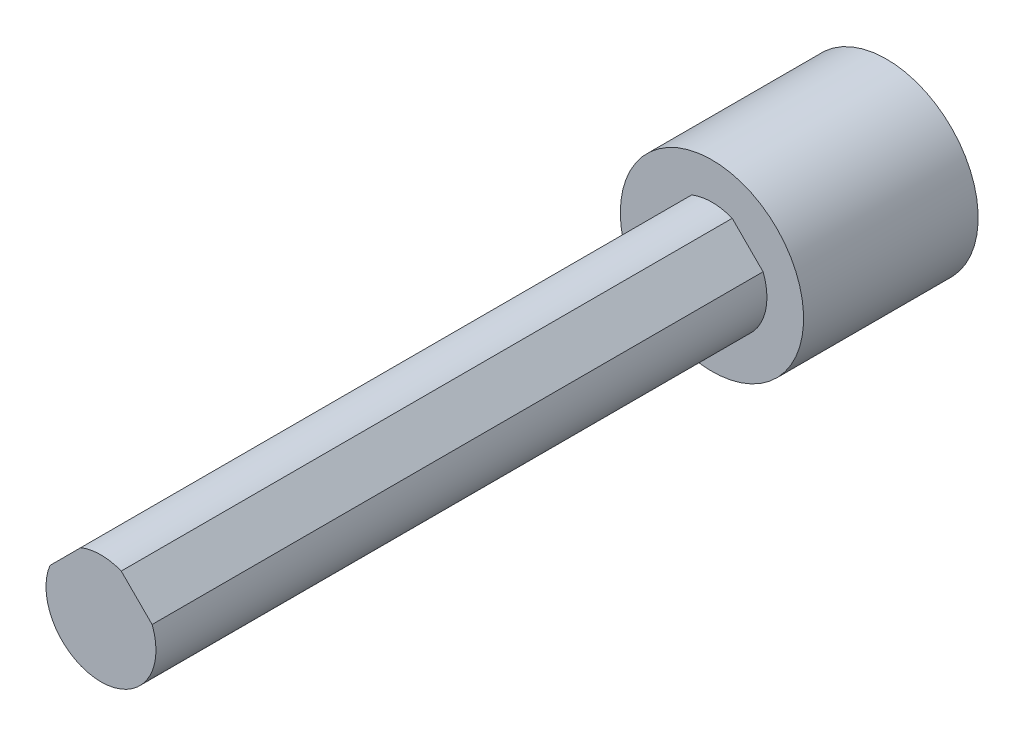
ISO-10303-21;
HEADER;
FILE_DESCRIPTION(('STEP AP214'),'2;1');
FILE_NAME('part.step','',(''),(''),'','','');
FILE_SCHEMA(('AUTOMOTIVE_DESIGN { 1 0 10303 214 1 1 1 1 }'));
ENDSEC;
DATA;
#1=APPLICATION_CONTEXT('core data for automotive mechanical design processes');
#2=APPLICATION_PROTOCOL_DEFINITION('international standard','automotive_design',2000,#1);
#3=PRODUCT_CONTEXT('',#1,'mechanical');
#4=PRODUCT('Part','Part','',(#3));
#5=PRODUCT_RELATED_PRODUCT_CATEGORY('part','',(#4));
#6=PRODUCT_DEFINITION_FORMATION('','',#4);
#7=PRODUCT_DEFINITION_CONTEXT('part definition',#1,'design');
#8=PRODUCT_DEFINITION('design','',#6,#7);
#9=PRODUCT_DEFINITION_SHAPE('','',#8);
#10=(LENGTH_UNIT() NAMED_UNIT(*) SI_UNIT(.MILLI.,.METRE.));
#11=(NAMED_UNIT(*) PLANE_ANGLE_UNIT() SI_UNIT($,.RADIAN.));
#12=(NAMED_UNIT(*) SI_UNIT($,.STERADIAN.) SOLID_ANGLE_UNIT());
#13=UNCERTAINTY_MEASURE_WITH_UNIT(LENGTH_MEASURE(1.E-05),#10,'distance_accuracy_value','');
#14=(GEOMETRIC_REPRESENTATION_CONTEXT(3) GLOBAL_UNCERTAINTY_ASSIGNED_CONTEXT((#13)) GLOBAL_UNIT_ASSIGNED_CONTEXT((#10,
#11,#12)) REPRESENTATION_CONTEXT('',''));
#15=CARTESIAN_POINT('',(0.,0.,0.));
#16=DIRECTION('',(0.,0.,1.));
#17=DIRECTION('',(1.,0.,0.));
#18=AXIS2_PLACEMENT_3D('',#15,#16,#17);
#19=CARTESIAN_POINT('',(0.,0.,44.45));
#20=DIRECTION('',(0.,0.,-1.));
#21=DIRECTION('',(-1.,0.,0.));
#22=AXIS2_PLACEMENT_3D('',#19,#20,#21);
#23=CYLINDRICAL_SURFACE('',#22,4.0005);
#24=CARTESIAN_POINT('',(0.,0.,0.));
#25=DIRECTION('',(0.,0.,1.));
#26=DIRECTION('',(1.,0.,0.));
#27=AXIS2_PLACEMENT_3D('',#24,#25,#26);
#28=CIRCLE('',#27,4.0005);
#29=CARTESIAN_POINT('',(1.47398911899948,3.71905314926678,0.));
#30=VERTEX_POINT('',#29);
#31=CARTESIAN_POINT('',(-1.47398911899948,3.71905314926678,0.));
#32=VERTEX_POINT('',#31);
#33=EDGE_CURVE('E75',#30,#32,#28,.T.);
#34=ORIENTED_EDGE('',*,*,#33,.T.);
#35=DIRECTION('',(0.,0.,-1.));
#36=VECTOR('',#35,1.);
#37=CARTESIAN_POINT('',(-1.47398911899948,3.71905314926678,44.45));
#38=LINE('',#37,#36);
#39=CARTESIAN_POINT('',(-1.47398911899948,3.71905314926678,44.45));
#40=VERTEX_POINT('',#39);
#41=EDGE_CURVE('E11',#40,#32,#38,.T.);
#42=ORIENTED_EDGE('',*,*,#41,.F.);
#43=CARTESIAN_POINT('',(0.,0.,44.45));
#44=DIRECTION('',(0.,0.,1.));
#45=DIRECTION('',(1.,0.,0.));
#46=AXIS2_PLACEMENT_3D('',#43,#44,#45);
#47=CIRCLE('',#46,4.0005);
#48=CARTESIAN_POINT('',(1.47398911899948,3.71905314926678,44.45));
#49=VERTEX_POINT('',#48);
#50=EDGE_CURVE('E79',#49,#40,#47,.T.);
#51=ORIENTED_EDGE('',*,*,#50,.F.);
#52=DIRECTION('',(0.,0.,-1.));
#53=VECTOR('',#52,1.);
#54=CARTESIAN_POINT('',(1.47398911899948,3.71905314926678,44.45));
#55=LINE('',#54,#53);
#56=EDGE_CURVE('E91',#49,#30,#55,.T.);
#57=ORIENTED_EDGE('',*,*,#56,.T.);
#58=EDGE_LOOP('',(#34,#42,#51,#57));
#59=FACE_BOUND('',#58,.T.);
#60=ADVANCED_FACE('F33',(#59),#23,.T.);
#61=CARTESIAN_POINT('',(-1.47398911899948,3.71905314926678,44.45));
#62=DIRECTION('',(0.707106781186546,-0.707106781186549,0.));
#63=DIRECTION('',(0.707106781186549,0.707106781186546,0.));
#64=AXIS2_PLACEMENT_3D('',#61,#62,#63);
#65=PLANE('',#64);
#66=DIRECTION('',(-0.707106781186549,-0.707106781186546,0.));
#67=VECTOR('',#66,1.);
#68=CARTESIAN_POINT('',(-1.47398911899948,3.71905314926678,0.));
#69=LINE('',#68,#67);
#70=CARTESIAN_POINT('',(-3.71905314926677,1.47398911899949,0.));
#71=VERTEX_POINT('',#70);
#72=EDGE_CURVE('E88',#32,#71,#69,.T.);
#73=ORIENTED_EDGE('',*,*,#72,.T.);
#74=DIRECTION('',(0.,0.,-1.));
#75=VECTOR('',#74,1.);
#76=CARTESIAN_POINT('',(-3.71905314926677,1.47398911899949,44.45));
#77=LINE('',#76,#75);
#78=CARTESIAN_POINT('',(-3.71905314926677,1.47398911899949,44.45));
#79=VERTEX_POINT('',#78);
#80=EDGE_CURVE('E41',#79,#71,#77,.T.);
#81=ORIENTED_EDGE('',*,*,#80,.F.);
#82=DIRECTION('',(-0.707106781186549,-0.707106781186546,0.));
#83=VECTOR('',#82,1.);
#84=CARTESIAN_POINT('',(-1.47398911899948,3.71905314926678,44.45));
#85=LINE('',#84,#83);
#86=EDGE_CURVE('E101',#40,#79,#85,.T.);
#87=ORIENTED_EDGE('',*,*,#86,.F.);
#88=ORIENTED_EDGE('',*,*,#41,.T.);
#89=EDGE_LOOP('',(#73,#81,#87,#88));
#90=FACE_BOUND('',#89,.T.);
#91=ADVANCED_FACE('F127',(#90),#65,.F.);
#92=CARTESIAN_POINT('',(0.,0.,44.45));
#93=DIRECTION('',(0.,0.,-1.));
#94=DIRECTION('',(-1.,0.,0.));
#95=AXIS2_PLACEMENT_3D('',#92,#93,#94);
#96=CYLINDRICAL_SURFACE('',#95,4.0005);
#97=CARTESIAN_POINT('',(0.,0.,0.));
#98=DIRECTION('',(0.,0.,1.));
#99=DIRECTION('',(1.,0.,0.));
#100=AXIS2_PLACEMENT_3D('',#97,#98,#99);
#101=CIRCLE('',#100,4.0005);
#102=CARTESIAN_POINT('',(3.71905314926677,1.47398911899949,0.));
#103=VERTEX_POINT('',#102);
#104=EDGE_CURVE('E72',#71,#103,#101,.T.);
#105=ORIENTED_EDGE('',*,*,#104,.T.);
#106=DIRECTION('',(0.,0.,-1.));
#107=VECTOR('',#106,1.);
#108=CARTESIAN_POINT('',(3.71905314926677,1.47398911899949,44.45));
#109=LINE('',#108,#107);
#110=CARTESIAN_POINT('',(3.71905314926677,1.47398911899949,44.45));
#111=VERTEX_POINT('',#110);
#112=EDGE_CURVE('E86',#111,#103,#109,.T.);
#113=ORIENTED_EDGE('',*,*,#112,.F.);
#114=CARTESIAN_POINT('',(0.,0.,44.45));
#115=DIRECTION('',(0.,0.,1.));
#116=DIRECTION('',(1.,0.,0.));
#117=AXIS2_PLACEMENT_3D('',#114,#115,#116);
#118=CIRCLE('',#117,4.0005);
#119=EDGE_CURVE('E99',#79,#111,#118,.T.);
#120=ORIENTED_EDGE('',*,*,#119,.F.);
#121=ORIENTED_EDGE('',*,*,#80,.T.);
#122=EDGE_LOOP('',(#105,#113,#120,#121));
#123=FACE_BOUND('',#122,.T.);
#124=ADVANCED_FACE('F84',(#123),#96,.T.);
#125=CARTESIAN_POINT('',(1.47398911899948,3.71905314926678,44.45));
#126=DIRECTION('',(-0.707106781186546,-0.707106781186549,0.));
#127=DIRECTION('',(0.707106781186549,-0.707106781186546,0.));
#128=AXIS2_PLACEMENT_3D('',#125,#126,#127);
#129=PLANE('',#128);
#130=DIRECTION('',(-0.707106781186549,0.707106781186546,0.));
#131=VECTOR('',#130,1.);
#132=CARTESIAN_POINT('',(1.47398911899948,3.71905314926678,0.));
#133=LINE('',#132,#131);
#134=EDGE_CURVE('E69',#103,#30,#133,.T.);
#135=ORIENTED_EDGE('',*,*,#134,.T.);
#136=ORIENTED_EDGE('',*,*,#56,.F.);
#137=DIRECTION('',(-0.707106781186549,0.707106781186546,0.));
#138=VECTOR('',#137,1.);
#139=CARTESIAN_POINT('',(1.47398911899948,3.71905314926678,44.45));
#140=LINE('',#139,#138);
#141=EDGE_CURVE('E48',#111,#49,#140,.T.);
#142=ORIENTED_EDGE('',*,*,#141,.F.);
#143=ORIENTED_EDGE('',*,*,#112,.T.);
#144=EDGE_LOOP('',(#135,#136,#142,#143));
#145=FACE_BOUND('',#144,.T.);
#146=ADVANCED_FACE('F90',(#145),#129,.F.);
#147=CARTESIAN_POINT('',(0.,0.,44.45));
#148=DIRECTION('',(0.,0.,1.));
#149=DIRECTION('',(1.,0.,0.));
#150=AXIS2_PLACEMENT_3D('',#147,#148,#149);
#151=PLANE('',#150);
#152=ORIENTED_EDGE('',*,*,#50,.T.);
#153=ORIENTED_EDGE('',*,*,#86,.T.);
#154=ORIENTED_EDGE('',*,*,#119,.T.);
#155=ORIENTED_EDGE('',*,*,#141,.T.);
#156=EDGE_LOOP('',(#152,#153,#154,#155));
#157=FACE_BOUND('',#156,.T.);
#158=ADVANCED_FACE('F119',(#157),#151,.T.);
#159=CARTESIAN_POINT('',(0.,0.,0.));
#160=DIRECTION('',(0.,0.,-1.));
#161=DIRECTION('',(-1.,0.,0.));
#162=AXIS2_PLACEMENT_3D('',#159,#160,#161);
#163=PLANE('',#162);
#164=CARTESIAN_POINT('',(0.,0.,0.));
#165=DIRECTION('',(0.,0.,-1.));
#166=DIRECTION('',(-1.,0.,0.));
#167=AXIS2_PLACEMENT_3D('',#164,#165,#166);
#168=CIRCLE('',#167,6.6675);
#169=CARTESIAN_POINT('',(-6.6675,0.,0.));
#170=VERTEX_POINT('',#169);
#171=EDGE_CURVE('E104',#170,#170,#168,.T.);
#172=ORIENTED_EDGE('',*,*,#171,.F.);
#173=EDGE_LOOP('',(#172));
#174=FACE_BOUND('',#173,.T.);
#175=ORIENTED_EDGE('',*,*,#72,.F.);
#176=ORIENTED_EDGE('',*,*,#33,.F.);
#177=ORIENTED_EDGE('',*,*,#134,.F.);
#178=ORIENTED_EDGE('',*,*,#104,.F.);
#179=EDGE_LOOP('',(#175,#176,#177,#178));
#180=FACE_BOUND('',#179,.T.);
#181=ADVANCED_FACE('F71',(#174,#180),#163,.F.);
#182=CARTESIAN_POINT('',(0.,0.,-12.7));
#183=DIRECTION('',(0.,0.,1.));
#184=DIRECTION('',(1.,0.,0.));
#185=AXIS2_PLACEMENT_3D('',#182,#183,#184);
#186=CYLINDRICAL_SURFACE('',#185,6.6675);
#187=CARTESIAN_POINT('',(0.,0.,-12.7));
#188=DIRECTION('',(0.,0.,-1.));
#189=DIRECTION('',(-1.,0.,0.));
#190=AXIS2_PLACEMENT_3D('',#187,#188,#189);
#191=CIRCLE('',#190,6.6675);
#192=CARTESIAN_POINT('',(-6.6675,0.,-12.7));
#193=VERTEX_POINT('',#192);
#194=EDGE_CURVE('E97',#193,#193,#191,.T.);
#195=ORIENTED_EDGE('',*,*,#194,.F.);
#196=EDGE_LOOP('',(#195));
#197=FACE_BOUND('',#196,.T.);
#198=ORIENTED_EDGE('',*,*,#171,.T.);
#199=EDGE_LOOP('',(#198));
#200=FACE_BOUND('',#199,.T.);
#201=ADVANCED_FACE('F112',(#197,#200),#186,.T.);
#202=CARTESIAN_POINT('',(0.,0.,-12.7));
#203=DIRECTION('',(0.,0.,-1.));
#204=DIRECTION('',(-1.,0.,0.));
#205=AXIS2_PLACEMENT_3D('',#202,#203,#204);
#206=PLANE('',#205);
#207=ORIENTED_EDGE('',*,*,#194,.T.);
#208=EDGE_LOOP('',(#207));
#209=FACE_BOUND('',#208,.T.);
#210=ADVANCED_FACE('F110',(#209),#206,.T.);
#211=CLOSED_SHELL('',(#60,#91,#124,#146,#158,#181,#201,#210));
#212=MANIFOLD_SOLID_BREP('B2',#211);
#213=ADVANCED_BREP_SHAPE_REPRESENTATION('',(#18,#212),#14);
#214=SHAPE_DEFINITION_REPRESENTATION(#9,#213);
ENDSEC;
END-ISO-10303-21;
